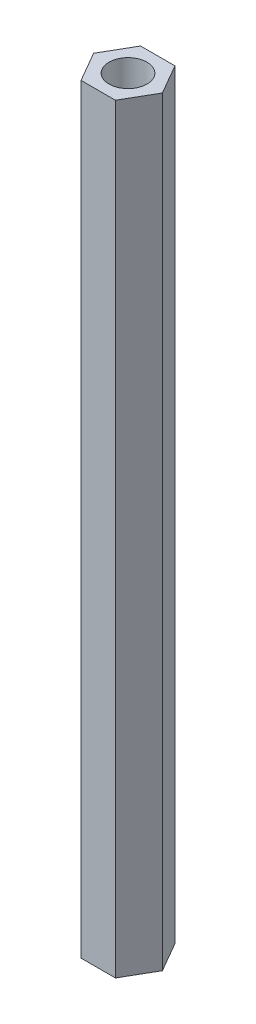
ISO-10303-21;
HEADER;
FILE_DESCRIPTION(('STEP AP214'),'2;1');
FILE_NAME('part.step','',(''),(''),'','','');
FILE_SCHEMA(('AUTOMOTIVE_DESIGN { 1 0 10303 214 1 1 1 1 }'));
ENDSEC;
DATA;
#1=APPLICATION_CONTEXT('core data for automotive mechanical design processes');
#2=APPLICATION_PROTOCOL_DEFINITION('international standard','automotive_design',2000,#1);
#3=PRODUCT_CONTEXT('',#1,'mechanical');
#4=PRODUCT('Part','Part','',(#3));
#5=PRODUCT_RELATED_PRODUCT_CATEGORY('part','',(#4));
#6=PRODUCT_DEFINITION_FORMATION('','',#4);
#7=PRODUCT_DEFINITION_CONTEXT('part definition',#1,'design');
#8=PRODUCT_DEFINITION('design','',#6,#7);
#9=PRODUCT_DEFINITION_SHAPE('','',#8);
#10=(LENGTH_UNIT() NAMED_UNIT(*) SI_UNIT(.MILLI.,.METRE.));
#11=(NAMED_UNIT(*) PLANE_ANGLE_UNIT() SI_UNIT($,.RADIAN.));
#12=(NAMED_UNIT(*) SI_UNIT($,.STERADIAN.) SOLID_ANGLE_UNIT());
#13=UNCERTAINTY_MEASURE_WITH_UNIT(LENGTH_MEASURE(1.E-05),#10,'distance_accuracy_value','');
#14=(GEOMETRIC_REPRESENTATION_CONTEXT(3) GLOBAL_UNCERTAINTY_ASSIGNED_CONTEXT((#13)) GLOBAL_UNIT_ASSIGNED_CONTEXT((#10,
#11,#12)) REPRESENTATION_CONTEXT('',''));
#15=CARTESIAN_POINT('',(0.,0.,0.));
#16=DIRECTION('',(0.,0.,1.));
#17=DIRECTION('',(1.,0.,0.));
#18=AXIS2_PLACEMENT_3D('',#15,#16,#17);
#19=CARTESIAN_POINT('',(0.,60.,0.));
#20=DIRECTION('',(0.,1.,0.));
#21=DIRECTION('',(0.,0.,1.));
#22=AXIS2_PLACEMENT_3D('',#19,#20,#21);
#23=PLANE('',#22);
#24=DIRECTION('',(0.5,0.,-0.866025403784439));
#25=VECTOR('',#24,1.);
#26=CARTESIAN_POINT('',(1.35677313259562,60.,2.35));
#27=LINE('',#26,#25);
#28=CARTESIAN_POINT('',(1.35677313259562,60.,2.35));
#29=VERTEX_POINT('',#28);
#30=CARTESIAN_POINT('',(2.71354626519124,60.,0.));
#31=VERTEX_POINT('',#30);
#32=EDGE_CURVE('E129',#29,#31,#27,.T.);
#33=ORIENTED_EDGE('',*,*,#32,.T.);
#34=DIRECTION('',(-0.5,0.,-0.866025403784439));
#35=VECTOR('',#34,1.);
#36=CARTESIAN_POINT('',(2.71354626519124,60.,0.));
#37=LINE('',#36,#35);
#38=CARTESIAN_POINT('',(1.35677313259562,60.,-2.35));
#39=VERTEX_POINT('',#38);
#40=EDGE_CURVE('E87',#31,#39,#37,.T.);
#41=ORIENTED_EDGE('',*,*,#40,.T.);
#42=DIRECTION('',(-1.,0.,0.));
#43=VECTOR('',#42,1.);
#44=CARTESIAN_POINT('',(1.35677313259562,60.,-2.35));
#45=LINE('',#44,#43);
#46=CARTESIAN_POINT('',(-1.35677313259562,60.,-2.35));
#47=VERTEX_POINT('',#46);
#48=EDGE_CURVE('E100',#39,#47,#45,.T.);
#49=ORIENTED_EDGE('',*,*,#48,.T.);
#50=DIRECTION('',(-0.5,0.,0.866025403784439));
#51=VECTOR('',#50,1.);
#52=CARTESIAN_POINT('',(-1.35677313259562,60.,-2.35));
#53=LINE('',#52,#51);
#54=CARTESIAN_POINT('',(-2.71354626519124,60.,0.));
#55=VERTEX_POINT('',#54);
#56=EDGE_CURVE('E94',#47,#55,#53,.T.);
#57=ORIENTED_EDGE('',*,*,#56,.T.);
#58=DIRECTION('',(0.5,0.,0.866025403784439));
#59=VECTOR('',#58,1.);
#60=CARTESIAN_POINT('',(-2.71354626519124,60.,0.));
#61=LINE('',#60,#59);
#62=CARTESIAN_POINT('',(-1.35677313259562,60.,2.35));
#63=VERTEX_POINT('',#62);
#64=EDGE_CURVE('E98',#55,#63,#61,.T.);
#65=ORIENTED_EDGE('',*,*,#64,.T.);
#66=DIRECTION('',(1.,0.,0.));
#67=VECTOR('',#66,1.);
#68=CARTESIAN_POINT('',(-1.35677313259562,60.,2.35));
#69=LINE('',#68,#67);
#70=EDGE_CURVE('E50',#63,#29,#69,.T.);
#71=ORIENTED_EDGE('',*,*,#70,.T.);
#72=EDGE_LOOP('',(#33,#41,#49,#57,#65,#71));
#73=FACE_BOUND('',#72,.T.);
#74=CARTESIAN_POINT('',(0.,60.,0.));
#75=DIRECTION('',(0.,1.,0.));
#76=DIRECTION('',(0.,0.,1.));
#77=AXIS2_PLACEMENT_3D('',#74,#75,#76);
#78=CIRCLE('',#77,1.5);
#79=CARTESIAN_POINT('',(0.,60.,1.5));
#80=VERTEX_POINT('',#79);
#81=EDGE_CURVE('E122',#80,#80,#78,.T.);
#82=ORIENTED_EDGE('',*,*,#81,.F.);
#83=EDGE_LOOP('',(#82));
#84=FACE_BOUND('',#83,.T.);
#85=ADVANCED_FACE('F33',(#73,#84),#23,.T.);
#86=CARTESIAN_POINT('',(0.,0.,0.));
#87=DIRECTION('',(0.,1.,0.));
#88=DIRECTION('',(0.,0.,1.));
#89=AXIS2_PLACEMENT_3D('',#86,#87,#88);
#90=PLANE('',#89);
#91=DIRECTION('',(0.5,0.,-0.866025403784439));
#92=VECTOR('',#91,1.);
#93=CARTESIAN_POINT('',(1.35677313259562,0.,2.35));
#94=LINE('',#93,#92);
#95=CARTESIAN_POINT('',(1.35677313259562,0.,2.35));
#96=VERTEX_POINT('',#95);
#97=CARTESIAN_POINT('',(2.71354626519124,0.,0.));
#98=VERTEX_POINT('',#97);
#99=EDGE_CURVE('E118',#96,#98,#94,.T.);
#100=ORIENTED_EDGE('',*,*,#99,.F.);
#101=DIRECTION('',(1.,0.,0.));
#102=VECTOR('',#101,1.);
#103=CARTESIAN_POINT('',(-1.35677313259562,0.,2.35));
#104=LINE('',#103,#102);
#105=CARTESIAN_POINT('',(-1.35677313259562,0.,2.35));
#106=VERTEX_POINT('',#105);
#107=EDGE_CURVE('E79',#106,#96,#104,.T.);
#108=ORIENTED_EDGE('',*,*,#107,.F.);
#109=DIRECTION('',(0.5,0.,0.866025403784439));
#110=VECTOR('',#109,1.);
#111=CARTESIAN_POINT('',(-2.71354626519124,0.,0.));
#112=LINE('',#111,#110);
#113=CARTESIAN_POINT('',(-2.71354626519124,0.,0.));
#114=VERTEX_POINT('',#113);
#115=EDGE_CURVE('E73',#114,#106,#112,.T.);
#116=ORIENTED_EDGE('',*,*,#115,.F.);
#117=DIRECTION('',(-0.5,0.,0.866025403784439));
#118=VECTOR('',#117,1.);
#119=CARTESIAN_POINT('',(-1.35677313259562,0.,-2.35));
#120=LINE('',#119,#118);
#121=CARTESIAN_POINT('',(-1.35677313259562,0.,-2.35));
#122=VERTEX_POINT('',#121);
#123=EDGE_CURVE('E108',#122,#114,#120,.T.);
#124=ORIENTED_EDGE('',*,*,#123,.F.);
#125=DIRECTION('',(-1.,0.,0.));
#126=VECTOR('',#125,1.);
#127=CARTESIAN_POINT('',(1.35677313259562,0.,-2.35));
#128=LINE('',#127,#126);
#129=CARTESIAN_POINT('',(1.35677313259562,0.,-2.35));
#130=VERTEX_POINT('',#129);
#131=EDGE_CURVE('E124',#130,#122,#128,.T.);
#132=ORIENTED_EDGE('',*,*,#131,.F.);
#133=DIRECTION('',(-0.5,0.,-0.866025403784439));
#134=VECTOR('',#133,1.);
#135=CARTESIAN_POINT('',(2.71354626519124,0.,0.));
#136=LINE('',#135,#134);
#137=EDGE_CURVE('E121',#98,#130,#136,.T.);
#138=ORIENTED_EDGE('',*,*,#137,.F.);
#139=EDGE_LOOP('',(#100,#108,#116,#124,#132,#138));
#140=FACE_BOUND('',#139,.T.);
#141=CARTESIAN_POINT('',(0.,0.,0.));
#142=DIRECTION('',(0.,1.,0.));
#143=DIRECTION('',(0.,0.,1.));
#144=AXIS2_PLACEMENT_3D('',#141,#142,#143);
#145=CIRCLE('',#144,1.5);
#146=CARTESIAN_POINT('',(0.,0.,1.5));
#147=VERTEX_POINT('',#146);
#148=EDGE_CURVE('E222',#147,#147,#145,.T.);
#149=ORIENTED_EDGE('',*,*,#148,.T.);
#150=EDGE_LOOP('',(#149));
#151=FACE_BOUND('',#150,.T.);
#152=ADVANCED_FACE('F138',(#140,#151),#90,.F.);
#153=CARTESIAN_POINT('',(1.35677313259562,60.,2.35));
#154=DIRECTION('',(-0.866025403784439,0.,-0.5));
#155=DIRECTION('',(-0.5,0.,0.866025403784439));
#156=AXIS2_PLACEMENT_3D('',#153,#154,#155);
#157=PLANE('',#156);
#158=ORIENTED_EDGE('',*,*,#99,.T.);
#159=DIRECTION('',(0.,-1.,0.));
#160=VECTOR('',#159,1.);
#161=CARTESIAN_POINT('',(2.71354626519124,60.,0.));
#162=LINE('',#161,#160);
#163=EDGE_CURVE('E11',#31,#98,#162,.T.);
#164=ORIENTED_EDGE('',*,*,#163,.F.);
#165=ORIENTED_EDGE('',*,*,#32,.F.);
#166=DIRECTION('',(0.,-1.,0.));
#167=VECTOR('',#166,1.);
#168=CARTESIAN_POINT('',(1.35677313259562,60.,2.35));
#169=LINE('',#168,#167);
#170=EDGE_CURVE('E114',#29,#96,#169,.T.);
#171=ORIENTED_EDGE('',*,*,#170,.T.);
#172=EDGE_LOOP('',(#158,#164,#165,#171));
#173=FACE_BOUND('',#172,.T.);
#174=ADVANCED_FACE('F35',(#173),#157,.F.);
#175=CARTESIAN_POINT('',(2.71354626519124,60.,0.));
#176=DIRECTION('',(-0.866025403784439,0.,0.5));
#177=DIRECTION('',(0.5,0.,0.866025403784439));
#178=AXIS2_PLACEMENT_3D('',#175,#176,#177);
#179=PLANE('',#178);
#180=ORIENTED_EDGE('',*,*,#137,.T.);
#181=DIRECTION('',(0.,-1.,0.));
#182=VECTOR('',#181,1.);
#183=CARTESIAN_POINT('',(1.35677313259562,60.,-2.35));
#184=LINE('',#183,#182);
#185=EDGE_CURVE('E42',#39,#130,#184,.T.);
#186=ORIENTED_EDGE('',*,*,#185,.F.);
#187=ORIENTED_EDGE('',*,*,#40,.F.);
#188=ORIENTED_EDGE('',*,*,#163,.T.);
#189=EDGE_LOOP('',(#180,#186,#187,#188));
#190=FACE_BOUND('',#189,.T.);
#191=ADVANCED_FACE('F163',(#190),#179,.F.);
#192=CARTESIAN_POINT('',(1.35677313259562,60.,-2.35));
#193=DIRECTION('',(0.,0.,1.));
#194=DIRECTION('',(1.,0.,0.));
#195=AXIS2_PLACEMENT_3D('',#192,#193,#194);
#196=PLANE('',#195);
#197=ORIENTED_EDGE('',*,*,#131,.T.);
#198=DIRECTION('',(0.,-1.,0.));
#199=VECTOR('',#198,1.);
#200=CARTESIAN_POINT('',(-1.35677313259562,60.,-2.35));
#201=LINE('',#200,#199);
#202=EDGE_CURVE('E109',#47,#122,#201,.T.);
#203=ORIENTED_EDGE('',*,*,#202,.F.);
#204=ORIENTED_EDGE('',*,*,#48,.F.);
#205=ORIENTED_EDGE('',*,*,#185,.T.);
#206=EDGE_LOOP('',(#197,#203,#204,#205));
#207=FACE_BOUND('',#206,.T.);
#208=ADVANCED_FACE('F135',(#207),#196,.F.);
#209=CARTESIAN_POINT('',(-1.35677313259562,60.,-2.35));
#210=DIRECTION('',(0.866025403784439,0.,0.5));
#211=DIRECTION('',(0.5,0.,-0.866025403784439));
#212=AXIS2_PLACEMENT_3D('',#209,#210,#211);
#213=PLANE('',#212);
#214=ORIENTED_EDGE('',*,*,#123,.T.);
#215=DIRECTION('',(0.,-1.,0.));
#216=VECTOR('',#215,1.);
#217=CARTESIAN_POINT('',(-2.71354626519124,60.,0.));
#218=LINE('',#217,#216);
#219=EDGE_CURVE('E105',#55,#114,#218,.T.);
#220=ORIENTED_EDGE('',*,*,#219,.F.);
#221=ORIENTED_EDGE('',*,*,#56,.F.);
#222=ORIENTED_EDGE('',*,*,#202,.T.);
#223=EDGE_LOOP('',(#214,#220,#221,#222));
#224=FACE_BOUND('',#223,.T.);
#225=ADVANCED_FACE('F106',(#224),#213,.F.);
#226=CARTESIAN_POINT('',(-2.71354626519124,60.,0.));
#227=DIRECTION('',(0.866025403784439,0.,-0.5));
#228=DIRECTION('',(-0.5,0.,-0.866025403784439));
#229=AXIS2_PLACEMENT_3D('',#226,#227,#228);
#230=PLANE('',#229);
#231=ORIENTED_EDGE('',*,*,#115,.T.);
#232=DIRECTION('',(0.,-1.,0.));
#233=VECTOR('',#232,1.);
#234=CARTESIAN_POINT('',(-1.35677313259562,60.,2.35));
#235=LINE('',#234,#233);
#236=EDGE_CURVE('E110',#63,#106,#235,.T.);
#237=ORIENTED_EDGE('',*,*,#236,.F.);
#238=ORIENTED_EDGE('',*,*,#64,.F.);
#239=ORIENTED_EDGE('',*,*,#219,.T.);
#240=EDGE_LOOP('',(#231,#237,#238,#239));
#241=FACE_BOUND('',#240,.T.);
#242=ADVANCED_FACE('F112',(#241),#230,.F.);
#243=CARTESIAN_POINT('',(-1.35677313259562,60.,2.35));
#244=DIRECTION('',(0.,0.,-1.));
#245=DIRECTION('',(-1.,0.,0.));
#246=AXIS2_PLACEMENT_3D('',#243,#244,#245);
#247=PLANE('',#246);
#248=ORIENTED_EDGE('',*,*,#107,.T.);
#249=ORIENTED_EDGE('',*,*,#170,.F.);
#250=ORIENTED_EDGE('',*,*,#70,.F.);
#251=ORIENTED_EDGE('',*,*,#236,.T.);
#252=EDGE_LOOP('',(#248,#249,#250,#251));
#253=FACE_BOUND('',#252,.T.);
#254=ADVANCED_FACE('F143',(#253),#247,.F.);
#255=CARTESIAN_POINT('',(0.,60.,0.));
#256=DIRECTION('',(0.,-1.,0.));
#257=DIRECTION('',(0.,0.,-1.));
#258=AXIS2_PLACEMENT_3D('',#255,#256,#257);
#259=CYLINDRICAL_SURFACE('',#258,1.5);
#260=ORIENTED_EDGE('',*,*,#81,.T.);
#261=EDGE_LOOP('',(#260));
#262=FACE_BOUND('',#261,.T.);
#263=ORIENTED_EDGE('',*,*,#148,.F.);
#264=EDGE_LOOP('',(#263));
#265=FACE_BOUND('',#264,.T.);
#266=ADVANCED_FACE('F145',(#262,#265),#259,.F.);
#267=CLOSED_SHELL('',(#85,#152,#174,#191,#208,#225,#242,#254,#266));
#268=MANIFOLD_SOLID_BREP('B2',#267);
#269=ADVANCED_BREP_SHAPE_REPRESENTATION('',(#18,#268),#14);
#270=SHAPE_DEFINITION_REPRESENTATION(#9,#269);
ENDSEC;
END-ISO-10303-21;
